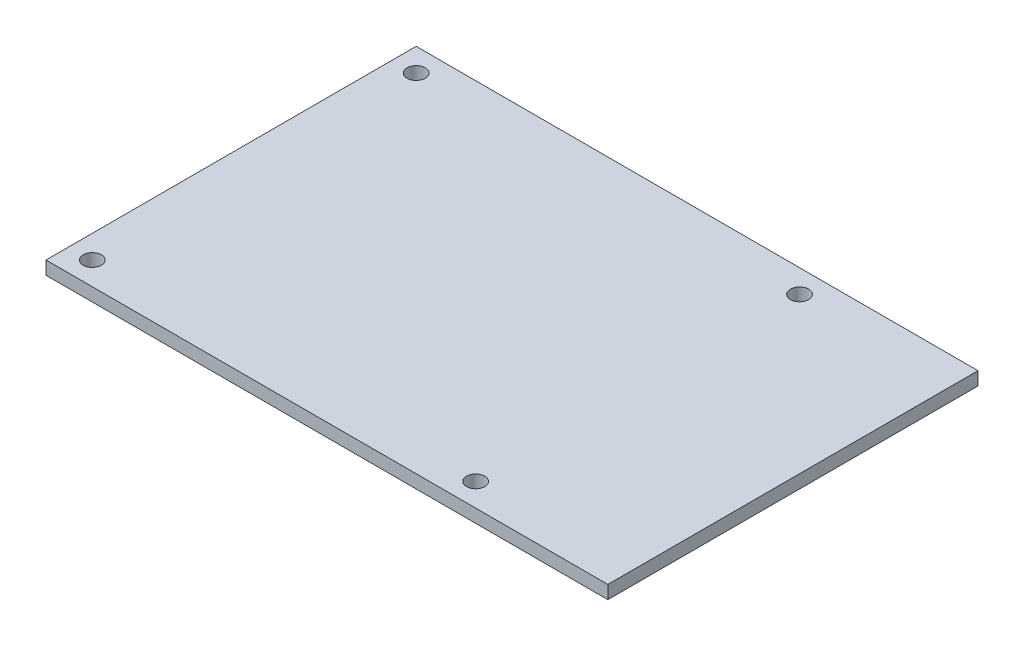
ISO-10303-21;
HEADER;
FILE_DESCRIPTION(('STEP AP214'),'2;1');
FILE_NAME('part.step','',(''),(''),'','','');
FILE_SCHEMA(('AUTOMOTIVE_DESIGN { 1 0 10303 214 1 1 1 1 }'));
ENDSEC;
DATA;
#1=APPLICATION_CONTEXT('core data for automotive mechanical design processes');
#2=APPLICATION_PROTOCOL_DEFINITION('international standard','automotive_design',2000,#1);
#3=PRODUCT_CONTEXT('',#1,'mechanical');
#4=PRODUCT('Part','Part','',(#3));
#5=PRODUCT_RELATED_PRODUCT_CATEGORY('part','',(#4));
#6=PRODUCT_DEFINITION_FORMATION('','',#4);
#7=PRODUCT_DEFINITION_CONTEXT('part definition',#1,'design');
#8=PRODUCT_DEFINITION('design','',#6,#7);
#9=PRODUCT_DEFINITION_SHAPE('','',#8);
#10=(LENGTH_UNIT() NAMED_UNIT(*) SI_UNIT(.MILLI.,.METRE.));
#11=(NAMED_UNIT(*) PLANE_ANGLE_UNIT() SI_UNIT($,.RADIAN.));
#12=(NAMED_UNIT(*) SI_UNIT($,.STERADIAN.) SOLID_ANGLE_UNIT());
#13=UNCERTAINTY_MEASURE_WITH_UNIT(LENGTH_MEASURE(1.E-05),#10,'distance_accuracy_value','');
#14=(GEOMETRIC_REPRESENTATION_CONTEXT(3) GLOBAL_UNCERTAINTY_ASSIGNED_CONTEXT((#13)) GLOBAL_UNIT_ASSIGNED_CONTEXT((#10,
#11,#12)) REPRESENTATION_CONTEXT('',''));
#15=CARTESIAN_POINT('',(0.,0.,0.));
#16=DIRECTION('',(0.,0.,1.));
#17=DIRECTION('',(1.,0.,0.));
#18=AXIS2_PLACEMENT_3D('',#15,#16,#17);
#19=CARTESIAN_POINT('',(0.,2.,0.));
#20=DIRECTION('',(0.,1.,0.));
#21=DIRECTION('',(0.,0.,1.));
#22=AXIS2_PLACEMENT_3D('',#19,#20,#21);
#23=PLANE('',#22);
#24=CARTESIAN_POINT('',(19.,2.,24.5));
#25=DIRECTION('',(0.,1.,0.));
#26=DIRECTION('',(0.,0.,1.));
#27=AXIS2_PLACEMENT_3D('',#24,#25,#26);
#28=CIRCLE('',#27,1.375);
#29=CARTESIAN_POINT('',(19.,2.,25.875));
#30=VERTEX_POINT('',#29);
#31=EDGE_CURVE('E120',#30,#30,#28,.T.);
#32=ORIENTED_EDGE('',*,*,#31,.F.);
#33=EDGE_LOOP('',(#32));
#34=FACE_BOUND('',#33,.T.);
#35=CARTESIAN_POINT('',(-39.,2.,24.5));
#36=DIRECTION('',(0.,1.,0.));
#37=DIRECTION('',(0.,0.,1.));
#38=AXIS2_PLACEMENT_3D('',#35,#36,#37);
#39=CIRCLE('',#38,1.375);
#40=CARTESIAN_POINT('',(-39.,2.,25.875));
#41=VERTEX_POINT('',#40);
#42=EDGE_CURVE('E99',#41,#41,#39,.T.);
#43=ORIENTED_EDGE('',*,*,#42,.F.);
#44=EDGE_LOOP('',(#43));
#45=FACE_BOUND('',#44,.T.);
#46=DIRECTION('',(0.,0.,-1.));
#47=VECTOR('',#46,1.);
#48=CARTESIAN_POINT('',(42.5,2.,-28.));
#49=LINE('',#48,#47);
#50=CARTESIAN_POINT('',(42.5,2.,28.));
#51=VERTEX_POINT('',#50);
#52=CARTESIAN_POINT('',(42.5,2.,-28.));
#53=VERTEX_POINT('',#52);
#54=EDGE_CURVE('E84',#51,#53,#49,.T.);
#55=ORIENTED_EDGE('',*,*,#54,.T.);
#56=DIRECTION('',(-1.,0.,0.));
#57=VECTOR('',#56,1.);
#58=CARTESIAN_POINT('',(-42.5,2.,-28.));
#59=LINE('',#58,#57);
#60=CARTESIAN_POINT('',(-42.5,2.,-28.));
#61=VERTEX_POINT('',#60);
#62=EDGE_CURVE('E79',#53,#61,#59,.T.);
#63=ORIENTED_EDGE('',*,*,#62,.T.);
#64=DIRECTION('',(0.,0.,1.));
#65=VECTOR('',#64,1.);
#66=CARTESIAN_POINT('',(-42.5,2.,-28.));
#67=LINE('',#66,#65);
#68=CARTESIAN_POINT('',(-42.5,2.,28.));
#69=VERTEX_POINT('',#68);
#70=EDGE_CURVE('E82',#61,#69,#67,.T.);
#71=ORIENTED_EDGE('',*,*,#70,.T.);
#72=DIRECTION('',(1.,0.,0.));
#73=VECTOR('',#72,1.);
#74=CARTESIAN_POINT('',(-42.5,2.,28.));
#75=LINE('',#74,#73);
#76=EDGE_CURVE('E49',#69,#51,#75,.T.);
#77=ORIENTED_EDGE('',*,*,#76,.T.);
#78=EDGE_LOOP('',(#55,#63,#71,#77));
#79=FACE_BOUND('',#78,.T.);
#80=CARTESIAN_POINT('',(-39.,2.,-24.5));
#81=DIRECTION('',(0.,1.,0.));
#82=DIRECTION('',(0.,0.,1.));
#83=AXIS2_PLACEMENT_3D('',#80,#81,#82);
#84=CIRCLE('',#83,1.375);
#85=CARTESIAN_POINT('',(-39.,2.,-23.125));
#86=VERTEX_POINT('',#85);
#87=EDGE_CURVE('E114',#86,#86,#84,.T.);
#88=ORIENTED_EDGE('',*,*,#87,.F.);
#89=EDGE_LOOP('',(#88));
#90=FACE_BOUND('',#89,.T.);
#91=CARTESIAN_POINT('',(19.,2.,-24.5));
#92=DIRECTION('',(0.,1.,0.));
#93=DIRECTION('',(0.,0.,1.));
#94=AXIS2_PLACEMENT_3D('',#91,#92,#93);
#95=CIRCLE('',#94,1.375);
#96=CARTESIAN_POINT('',(19.,2.,-23.125));
#97=VERTEX_POINT('',#96);
#98=EDGE_CURVE('E126',#97,#97,#95,.T.);
#99=ORIENTED_EDGE('',*,*,#98,.F.);
#100=EDGE_LOOP('',(#99));
#101=FACE_BOUND('',#100,.T.);
#102=ADVANCED_FACE('F32',(#34,#45,#79,#90,#101),#23,.T.);
#103=CARTESIAN_POINT('',(0.,0.,0.));
#104=DIRECTION('',(0.,1.,0.));
#105=DIRECTION('',(0.,0.,1.));
#106=AXIS2_PLACEMENT_3D('',#103,#104,#105);
#107=PLANE('',#106);
#108=CARTESIAN_POINT('',(19.,0.,24.5));
#109=DIRECTION('',(0.,1.,0.));
#110=DIRECTION('',(0.,0.,1.));
#111=AXIS2_PLACEMENT_3D('',#108,#109,#110);
#112=CIRCLE('',#111,1.375);
#113=CARTESIAN_POINT('',(19.,0.,25.875));
#114=VERTEX_POINT('',#113);
#115=EDGE_CURVE('E123',#114,#114,#112,.T.);
#116=ORIENTED_EDGE('',*,*,#115,.T.);
#117=EDGE_LOOP('',(#116));
#118=FACE_BOUND('',#117,.T.);
#119=CARTESIAN_POINT('',(-39.,0.,24.5));
#120=DIRECTION('',(0.,1.,0.));
#121=DIRECTION('',(0.,0.,1.));
#122=AXIS2_PLACEMENT_3D('',#119,#120,#121);
#123=CIRCLE('',#122,1.375);
#124=CARTESIAN_POINT('',(-39.,0.,25.875));
#125=VERTEX_POINT('',#124);
#126=EDGE_CURVE('E111',#125,#125,#123,.T.);
#127=ORIENTED_EDGE('',*,*,#126,.T.);
#128=EDGE_LOOP('',(#127));
#129=FACE_BOUND('',#128,.T.);
#130=DIRECTION('',(0.,0.,-1.));
#131=VECTOR('',#130,1.);
#132=CARTESIAN_POINT('',(42.5,0.,-28.));
#133=LINE('',#132,#131);
#134=CARTESIAN_POINT('',(42.5,0.,28.));
#135=VERTEX_POINT('',#134);
#136=CARTESIAN_POINT('',(42.5,0.,-28.));
#137=VERTEX_POINT('',#136);
#138=EDGE_CURVE('E96',#135,#137,#133,.T.);
#139=ORIENTED_EDGE('',*,*,#138,.F.);
#140=DIRECTION('',(1.,0.,0.));
#141=VECTOR('',#140,1.);
#142=CARTESIAN_POINT('',(-42.5,0.,28.));
#143=LINE('',#142,#141);
#144=CARTESIAN_POINT('',(-42.5,0.,28.));
#145=VERTEX_POINT('',#144);
#146=EDGE_CURVE('E72',#145,#135,#143,.T.);
#147=ORIENTED_EDGE('',*,*,#146,.F.);
#148=DIRECTION('',(0.,0.,1.));
#149=VECTOR('',#148,1.);
#150=CARTESIAN_POINT('',(-42.5,0.,-28.));
#151=LINE('',#150,#149);
#152=CARTESIAN_POINT('',(-42.5,0.,-28.));
#153=VERTEX_POINT('',#152);
#154=EDGE_CURVE('E66',#153,#145,#151,.T.);
#155=ORIENTED_EDGE('',*,*,#154,.F.);
#156=DIRECTION('',(-1.,0.,0.));
#157=VECTOR('',#156,1.);
#158=CARTESIAN_POINT('',(-42.5,0.,-28.));
#159=LINE('',#158,#157);
#160=EDGE_CURVE('E88',#137,#153,#159,.T.);
#161=ORIENTED_EDGE('',*,*,#160,.F.);
#162=EDGE_LOOP('',(#139,#147,#155,#161));
#163=FACE_BOUND('',#162,.T.);
#164=CARTESIAN_POINT('',(-39.,0.,-24.5));
#165=DIRECTION('',(0.,1.,0.));
#166=DIRECTION('',(0.,0.,1.));
#167=AXIS2_PLACEMENT_3D('',#164,#165,#166);
#168=CIRCLE('',#167,1.375);
#169=CARTESIAN_POINT('',(-39.,0.,-23.125));
#170=VERTEX_POINT('',#169);
#171=EDGE_CURVE('E117',#170,#170,#168,.T.);
#172=ORIENTED_EDGE('',*,*,#171,.T.);
#173=EDGE_LOOP('',(#172));
#174=FACE_BOUND('',#173,.T.);
#175=CARTESIAN_POINT('',(19.,0.,-24.5));
#176=DIRECTION('',(0.,1.,0.));
#177=DIRECTION('',(0.,0.,1.));
#178=AXIS2_PLACEMENT_3D('',#175,#176,#177);
#179=CIRCLE('',#178,1.375);
#180=CARTESIAN_POINT('',(19.,0.,-23.125));
#181=VERTEX_POINT('',#180);
#182=EDGE_CURVE('E129',#181,#181,#179,.T.);
#183=ORIENTED_EDGE('',*,*,#182,.T.);
#184=EDGE_LOOP('',(#183));
#185=FACE_BOUND('',#184,.T.);
#186=ADVANCED_FACE('F107',(#118,#129,#163,#174,#185),#107,.F.);
#187=CARTESIAN_POINT('',(42.5,2.,-28.));
#188=DIRECTION('',(-1.,0.,0.));
#189=DIRECTION('',(0.,0.,1.));
#190=AXIS2_PLACEMENT_3D('',#187,#188,#189);
#191=PLANE('',#190);
#192=ORIENTED_EDGE('',*,*,#138,.T.);
#193=DIRECTION('',(0.,-1.,0.));
#194=VECTOR('',#193,1.);
#195=CARTESIAN_POINT('',(42.5,2.,-28.));
#196=LINE('',#195,#194);
#197=EDGE_CURVE('E11',#53,#137,#196,.T.);
#198=ORIENTED_EDGE('',*,*,#197,.F.);
#199=ORIENTED_EDGE('',*,*,#54,.F.);
#200=DIRECTION('',(0.,-1.,0.));
#201=VECTOR('',#200,1.);
#202=CARTESIAN_POINT('',(42.5,2.,28.));
#203=LINE('',#202,#201);
#204=EDGE_CURVE('E92',#51,#135,#203,.T.);
#205=ORIENTED_EDGE('',*,*,#204,.T.);
#206=EDGE_LOOP('',(#192,#198,#199,#205));
#207=FACE_BOUND('',#206,.T.);
#208=ADVANCED_FACE('F34',(#207),#191,.F.);
#209=CARTESIAN_POINT('',(-42.5,2.,-28.));
#210=DIRECTION('',(0.,0.,1.));
#211=DIRECTION('',(1.,0.,0.));
#212=AXIS2_PLACEMENT_3D('',#209,#210,#211);
#213=PLANE('',#212);
#214=ORIENTED_EDGE('',*,*,#160,.T.);
#215=DIRECTION('',(0.,-1.,0.));
#216=VECTOR('',#215,1.);
#217=CARTESIAN_POINT('',(-42.5,2.,-28.));
#218=LINE('',#217,#216);
#219=EDGE_CURVE('E41',#61,#153,#218,.T.);
#220=ORIENTED_EDGE('',*,*,#219,.F.);
#221=ORIENTED_EDGE('',*,*,#62,.F.);
#222=ORIENTED_EDGE('',*,*,#197,.T.);
#223=EDGE_LOOP('',(#214,#220,#221,#222));
#224=FACE_BOUND('',#223,.T.);
#225=ADVANCED_FACE('F87',(#224),#213,.F.);
#226=CARTESIAN_POINT('',(-42.5,2.,-28.));
#227=DIRECTION('',(1.,0.,0.));
#228=DIRECTION('',(0.,0.,-1.));
#229=AXIS2_PLACEMENT_3D('',#226,#227,#228);
#230=PLANE('',#229);
#231=ORIENTED_EDGE('',*,*,#154,.T.);
#232=DIRECTION('',(0.,-1.,0.));
#233=VECTOR('',#232,1.);
#234=CARTESIAN_POINT('',(-42.5,2.,28.));
#235=LINE('',#234,#233);
#236=EDGE_CURVE('E89',#69,#145,#235,.T.);
#237=ORIENTED_EDGE('',*,*,#236,.F.);
#238=ORIENTED_EDGE('',*,*,#70,.F.);
#239=ORIENTED_EDGE('',*,*,#219,.T.);
#240=EDGE_LOOP('',(#231,#237,#238,#239));
#241=FACE_BOUND('',#240,.T.);
#242=ADVANCED_FACE('F90',(#241),#230,.F.);
#243=CARTESIAN_POINT('',(-42.5,2.,28.));
#244=DIRECTION('',(0.,0.,-1.));
#245=DIRECTION('',(-1.,0.,0.));
#246=AXIS2_PLACEMENT_3D('',#243,#244,#245);
#247=PLANE('',#246);
#248=ORIENTED_EDGE('',*,*,#146,.T.);
#249=ORIENTED_EDGE('',*,*,#204,.F.);
#250=ORIENTED_EDGE('',*,*,#76,.F.);
#251=ORIENTED_EDGE('',*,*,#236,.T.);
#252=EDGE_LOOP('',(#248,#249,#250,#251));
#253=FACE_BOUND('',#252,.T.);
#254=ADVANCED_FACE('F104',(#253),#247,.F.);
#255=CARTESIAN_POINT('',(-39.,2.,24.5));
#256=DIRECTION('',(0.,-1.,0.));
#257=DIRECTION('',(0.,0.,-1.));
#258=AXIS2_PLACEMENT_3D('',#255,#256,#257);
#259=CYLINDRICAL_SURFACE('',#258,1.375);
#260=ORIENTED_EDGE('',*,*,#42,.T.);
#261=EDGE_LOOP('',(#260));
#262=FACE_BOUND('',#261,.T.);
#263=ORIENTED_EDGE('',*,*,#126,.F.);
#264=EDGE_LOOP('',(#263));
#265=FACE_BOUND('',#264,.T.);
#266=ADVANCED_FACE('F149',(#262,#265),#259,.F.);
#267=CARTESIAN_POINT('',(-39.,2.,-24.5));
#268=DIRECTION('',(0.,-1.,0.));
#269=DIRECTION('',(0.,0.,-1.));
#270=AXIS2_PLACEMENT_3D('',#267,#268,#269);
#271=CYLINDRICAL_SURFACE('',#270,1.375);
#272=ORIENTED_EDGE('',*,*,#87,.T.);
#273=EDGE_LOOP('',(#272));
#274=FACE_BOUND('',#273,.T.);
#275=ORIENTED_EDGE('',*,*,#171,.F.);
#276=EDGE_LOOP('',(#275));
#277=FACE_BOUND('',#276,.T.);
#278=ADVANCED_FACE('F195',(#274,#277),#271,.F.);
#279=CARTESIAN_POINT('',(19.,2.,24.5));
#280=DIRECTION('',(0.,-1.,0.));
#281=DIRECTION('',(0.,0.,-1.));
#282=AXIS2_PLACEMENT_3D('',#279,#280,#281);
#283=CYLINDRICAL_SURFACE('',#282,1.375);
#284=ORIENTED_EDGE('',*,*,#31,.T.);
#285=EDGE_LOOP('',(#284));
#286=FACE_BOUND('',#285,.T.);
#287=ORIENTED_EDGE('',*,*,#115,.F.);
#288=EDGE_LOOP('',(#287));
#289=FACE_BOUND('',#288,.T.);
#290=ADVANCED_FACE('F203',(#286,#289),#283,.F.);
#291=CARTESIAN_POINT('',(19.,2.,-24.5));
#292=DIRECTION('',(0.,-1.,0.));
#293=DIRECTION('',(0.,0.,-1.));
#294=AXIS2_PLACEMENT_3D('',#291,#292,#293);
#295=CYLINDRICAL_SURFACE('',#294,1.375);
#296=ORIENTED_EDGE('',*,*,#98,.T.);
#297=EDGE_LOOP('',(#296));
#298=FACE_BOUND('',#297,.T.);
#299=ORIENTED_EDGE('',*,*,#182,.F.);
#300=EDGE_LOOP('',(#299));
#301=FACE_BOUND('',#300,.T.);
#302=ADVANCED_FACE('F135',(#298,#301),#295,.F.);
#303=CLOSED_SHELL('',(#102,#186,#208,#225,#242,#254,#266,#278,#290,#302));
#304=MANIFOLD_SOLID_BREP('B2',#303);
#305=ADVANCED_BREP_SHAPE_REPRESENTATION('',(#18,#304),#14);
#306=SHAPE_DEFINITION_REPRESENTATION(#9,#305);
ENDSEC;
END-ISO-10303-21;
